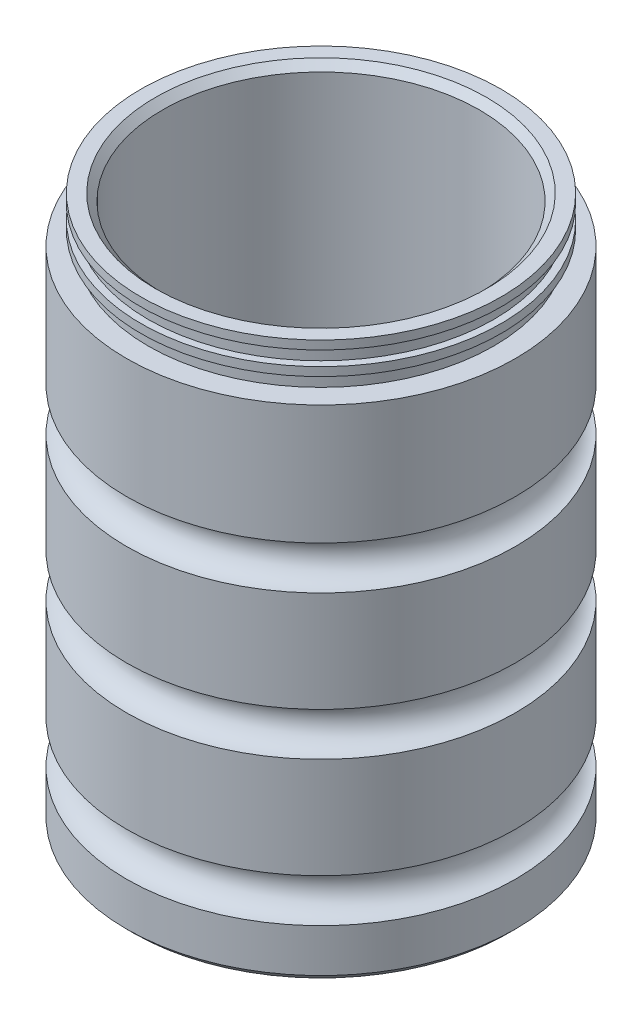
ISO-10303-21;
HEADER;
FILE_DESCRIPTION(('STEP AP214'),'2;1');
FILE_NAME('part.step','',(''),(''),'','','');
FILE_SCHEMA(('AUTOMOTIVE_DESIGN { 1 0 10303 214 1 1 1 1 }'));
ENDSEC;
DATA;
#1=APPLICATION_CONTEXT('core data for automotive mechanical design processes');
#2=APPLICATION_PROTOCOL_DEFINITION('international standard','automotive_design',2000,#1);
#3=PRODUCT_CONTEXT('',#1,'mechanical');
#4=PRODUCT('Part','Part','',(#3));
#5=PRODUCT_RELATED_PRODUCT_CATEGORY('part','',(#4));
#6=PRODUCT_DEFINITION_FORMATION('','',#4);
#7=PRODUCT_DEFINITION_CONTEXT('part definition',#1,'design');
#8=PRODUCT_DEFINITION('design','',#6,#7);
#9=PRODUCT_DEFINITION_SHAPE('','',#8);
#10=(LENGTH_UNIT() NAMED_UNIT(*) SI_UNIT(.MILLI.,.METRE.));
#11=(NAMED_UNIT(*) PLANE_ANGLE_UNIT() SI_UNIT($,.RADIAN.));
#12=(NAMED_UNIT(*) SI_UNIT($,.STERADIAN.) SOLID_ANGLE_UNIT());
#13=UNCERTAINTY_MEASURE_WITH_UNIT(LENGTH_MEASURE(1.E-05),#10,'distance_accuracy_value','');
#14=(GEOMETRIC_REPRESENTATION_CONTEXT(3) GLOBAL_UNCERTAINTY_ASSIGNED_CONTEXT((#13)) GLOBAL_UNIT_ASSIGNED_CONTEXT((#10,
#11,#12)) REPRESENTATION_CONTEXT('',''));
#15=CARTESIAN_POINT('',(0.,0.,0.));
#16=DIRECTION('',(0.,0.,1.));
#17=DIRECTION('',(1.,0.,0.));
#18=AXIS2_PLACEMENT_3D('',#15,#16,#17);
#19=CARTESIAN_POINT('',(0.,-29.1154086371947,0.));
#20=DIRECTION('',(0.,-1.,0.));
#21=DIRECTION('',(0.,0.,-1.));
#22=AXIS2_PLACEMENT_3D('',#19,#20,#21);
#23=CYLINDRICAL_SURFACE('',#22,11.);
#24=CARTESIAN_POINT('',(0.,37.5,0.));
#25=DIRECTION('',(0.,-1.,0.));
#26=DIRECTION('',(0.,0.,-1.));
#27=AXIS2_PLACEMENT_3D('',#24,#25,#26);
#28=CIRCLE('',#27,11.);
#29=CARTESIAN_POINT('',(0.,37.5,-11.));
#30=VERTEX_POINT('',#29);
#31=EDGE_CURVE('E49',#30,#30,#28,.F.);
#32=ORIENTED_EDGE('',*,*,#31,.T.);
#33=EDGE_LOOP('',(#32));
#34=FACE_BOUND('',#33,.T.);
#35=CARTESIAN_POINT('',(0.,12.,0.));
#36=DIRECTION('',(0.,-1.,0.));
#37=DIRECTION('',(0.,0.,-1.));
#38=AXIS2_PLACEMENT_3D('',#35,#36,#37);
#39=CIRCLE('',#38,11.);
#40=CARTESIAN_POINT('',(0.,12.,-11.));
#41=VERTEX_POINT('',#40);
#42=EDGE_CURVE('E82',#41,#41,#39,.T.);
#43=ORIENTED_EDGE('',*,*,#42,.T.);
#44=EDGE_LOOP('',(#43));
#45=FACE_BOUND('',#44,.T.);
#46=ADVANCED_FACE('F37',(#34,#45),#23,.F.);
#47=CARTESIAN_POINT('',(-11.,12.,0.));
#48=DIRECTION('',(0.,-1.,0.));
#49=DIRECTION('',(0.,0.,-1.));
#50=AXIS2_PLACEMENT_3D('',#47,#48,#49);
#51=PLANE('',#50);
#52=CARTESIAN_POINT('',(0.,12.,0.));
#53=DIRECTION('',(0.,-1.,0.));
#54=DIRECTION('',(0.,0.,-1.));
#55=AXIS2_PLACEMENT_3D('',#52,#53,#54);
#56=CIRCLE('',#55,2.5);
#57=CARTESIAN_POINT('',(0.,12.,-2.5));
#58=VERTEX_POINT('',#57);
#59=EDGE_CURVE('E79',#58,#58,#56,.T.);
#60=ORIENTED_EDGE('',*,*,#59,.T.);
#61=EDGE_LOOP('',(#60));
#62=FACE_BOUND('',#61,.T.);
#63=ORIENTED_EDGE('',*,*,#42,.F.);
#64=EDGE_LOOP('',(#63));
#65=FACE_BOUND('',#64,.T.);
#66=ADVANCED_FACE('F155',(#62,#65),#51,.F.);
#67=CARTESIAN_POINT('',(0.,0.,0.));
#68=DIRECTION('',(0.,1.,0.));
#69=DIRECTION('',(0.,0.,1.));
#70=AXIS2_PLACEMENT_3D('',#67,#68,#69);
#71=PLANE('',#70);
#72=CARTESIAN_POINT('',(0.,0.,0.));
#73=DIRECTION('',(0.,1.,0.));
#74=DIRECTION('',(0.,0.,1.));
#75=AXIS2_PLACEMENT_3D('',#72,#73,#74);
#76=CIRCLE('',#75,13.);
#77=CARTESIAN_POINT('',(0.,0.,13.));
#78=VERTEX_POINT('',#77);
#79=EDGE_CURVE('E45',#78,#78,#76,.F.);
#80=ORIENTED_EDGE('',*,*,#79,.T.);
#81=EDGE_LOOP('',(#80));
#82=FACE_BOUND('',#81,.T.);
#83=CARTESIAN_POINT('',(-8.,0.,0.));
#84=DIRECTION('',(0.,1.,0.));
#85=DIRECTION('',(0.,0.,1.));
#86=AXIS2_PLACEMENT_3D('',#83,#84,#85);
#87=CIRCLE('',#86,3.);
#88=CARTESIAN_POINT('',(-8.,0.,3.));
#89=VERTEX_POINT('',#88);
#90=EDGE_CURVE('E61',#89,#89,#87,.T.);
#91=ORIENTED_EDGE('',*,*,#90,.T.);
#92=EDGE_LOOP('',(#91));
#93=FACE_BOUND('',#92,.T.);
#94=CARTESIAN_POINT('',(8.,0.,0.));
#95=DIRECTION('',(0.,1.,0.));
#96=DIRECTION('',(0.,0.,1.));
#97=AXIS2_PLACEMENT_3D('',#94,#95,#96);
#98=CIRCLE('',#97,3.);
#99=CARTESIAN_POINT('',(8.,0.,3.));
#100=VERTEX_POINT('',#99);
#101=EDGE_CURVE('E64',#100,#100,#98,.T.);
#102=ORIENTED_EDGE('',*,*,#101,.T.);
#103=EDGE_LOOP('',(#102));
#104=FACE_BOUND('',#103,.T.);
#105=CARTESIAN_POINT('',(0.,0.,0.));
#106=DIRECTION('',(0.,1.,0.));
#107=DIRECTION('',(0.,0.,1.));
#108=AXIS2_PLACEMENT_3D('',#105,#106,#107);
#109=CIRCLE('',#108,2.5);
#110=CARTESIAN_POINT('',(0.,0.,2.5));
#111=VERTEX_POINT('',#110);
#112=EDGE_CURVE('E70',#111,#111,#109,.T.);
#113=ORIENTED_EDGE('',*,*,#112,.T.);
#114=EDGE_LOOP('',(#113));
#115=FACE_BOUND('',#114,.T.);
#116=ADVANCED_FACE('F161',(#82,#93,#104,#115),#71,.F.);
#117=CARTESIAN_POINT('',(0.,-29.1154086371947,0.));
#118=DIRECTION('',(0.,-1.,0.));
#119=DIRECTION('',(0.,0.,-1.));
#120=AXIS2_PLACEMENT_3D('',#117,#118,#119);
#121=CYLINDRICAL_SURFACE('',#120,13.5);
#122=CARTESIAN_POINT('',(0.,0.500000000000004,0.));
#123=DIRECTION('',(0.,1.,0.));
#124=DIRECTION('',(0.,0.,1.));
#125=AXIS2_PLACEMENT_3D('',#122,#123,#124);
#126=CIRCLE('',#125,13.5);
#127=CARTESIAN_POINT('',(0.,0.500000000000004,13.5));
#128=VERTEX_POINT('',#127);
#129=EDGE_CURVE('E10',#128,#128,#126,.T.);
#130=ORIENTED_EDGE('',*,*,#129,.T.);
#131=EDGE_LOOP('',(#130));
#132=FACE_BOUND('',#131,.T.);
#133=CARTESIAN_POINT('',(0.,3.5,0.));
#134=DIRECTION('',(0.,-1.,0.));
#135=DIRECTION('',(0.,0.,-1.));
#136=AXIS2_PLACEMENT_3D('',#133,#134,#135);
#137=CIRCLE('',#136,13.5);
#138=CARTESIAN_POINT('',(0.,3.5,-13.5));
#139=VERTEX_POINT('',#138);
#140=EDGE_CURVE('E85',#139,#139,#137,.T.);
#141=ORIENTED_EDGE('',*,*,#140,.T.);
#142=EDGE_LOOP('',(#141));
#143=FACE_BOUND('',#142,.T.);
#144=ADVANCED_FACE('F273',(#132,#143),#121,.T.);
#145=CARTESIAN_POINT('',(0.,5.,0.));
#146=DIRECTION('',(0.,-1.,0.));
#147=DIRECTION('',(0.,0.,-1.));
#148=AXIS2_PLACEMENT_3D('',#145,#146,#147);
#149=TOROIDAL_SURFACE('',#148,13.5,1.5);
#150=ORIENTED_EDGE('',*,*,#140,.F.);
#151=EDGE_LOOP('',(#150));
#152=FACE_BOUND('',#151,.T.);
#153=CARTESIAN_POINT('',(0.,6.5,0.));
#154=DIRECTION('',(0.,-1.,0.));
#155=DIRECTION('',(0.,0.,-1.));
#156=AXIS2_PLACEMENT_3D('',#153,#154,#155);
#157=CIRCLE('',#156,13.5);
#158=CARTESIAN_POINT('',(0.,6.5,-13.5));
#159=VERTEX_POINT('',#158);
#160=EDGE_CURVE('E88',#159,#159,#157,.T.);
#161=ORIENTED_EDGE('',*,*,#160,.T.);
#162=EDGE_LOOP('',(#161));
#163=FACE_BOUND('',#162,.T.);
#164=ADVANCED_FACE('F269',(#152,#163),#149,.F.);
#165=CARTESIAN_POINT('',(0.,-29.1154086371947,0.));
#166=DIRECTION('',(0.,-1.,0.));
#167=DIRECTION('',(0.,0.,-1.));
#168=AXIS2_PLACEMENT_3D('',#165,#166,#167);
#169=CYLINDRICAL_SURFACE('',#168,13.5);
#170=ORIENTED_EDGE('',*,*,#160,.F.);
#171=EDGE_LOOP('',(#170));
#172=FACE_BOUND('',#171,.T.);
#173=CARTESIAN_POINT('',(0.,13.5,0.));
#174=DIRECTION('',(0.,-1.,0.));
#175=DIRECTION('',(0.,0.,-1.));
#176=AXIS2_PLACEMENT_3D('',#173,#174,#175);
#177=CIRCLE('',#176,13.5);
#178=CARTESIAN_POINT('',(0.,13.5,-13.5));
#179=VERTEX_POINT('',#178);
#180=EDGE_CURVE('E91',#179,#179,#177,.T.);
#181=ORIENTED_EDGE('',*,*,#180,.T.);
#182=EDGE_LOOP('',(#181));
#183=FACE_BOUND('',#182,.T.);
#184=ADVANCED_FACE('F265',(#172,#183),#169,.T.);
#185=CARTESIAN_POINT('',(0.,15.,0.));
#186=DIRECTION('',(0.,-1.,0.));
#187=DIRECTION('',(0.,0.,-1.));
#188=AXIS2_PLACEMENT_3D('',#185,#186,#187);
#189=TOROIDAL_SURFACE('',#188,13.5,1.5);
#190=ORIENTED_EDGE('',*,*,#180,.F.);
#191=EDGE_LOOP('',(#190));
#192=FACE_BOUND('',#191,.T.);
#193=CARTESIAN_POINT('',(0.,16.5,0.));
#194=DIRECTION('',(0.,-1.,0.));
#195=DIRECTION('',(0.,0.,-1.));
#196=AXIS2_PLACEMENT_3D('',#193,#194,#195);
#197=CIRCLE('',#196,13.5);
#198=CARTESIAN_POINT('',(0.,16.5,-13.5));
#199=VERTEX_POINT('',#198);
#200=EDGE_CURVE('E94',#199,#199,#197,.T.);
#201=ORIENTED_EDGE('',*,*,#200,.T.);
#202=EDGE_LOOP('',(#201));
#203=FACE_BOUND('',#202,.T.);
#204=ADVANCED_FACE('F261',(#192,#203),#189,.F.);
#205=CARTESIAN_POINT('',(0.,-29.1154086371947,0.));
#206=DIRECTION('',(0.,-1.,0.));
#207=DIRECTION('',(0.,0.,-1.));
#208=AXIS2_PLACEMENT_3D('',#205,#206,#207);
#209=CYLINDRICAL_SURFACE('',#208,13.5);
#210=ORIENTED_EDGE('',*,*,#200,.F.);
#211=EDGE_LOOP('',(#210));
#212=FACE_BOUND('',#211,.T.);
#213=CARTESIAN_POINT('',(0.,23.5,0.));
#214=DIRECTION('',(0.,-1.,0.));
#215=DIRECTION('',(0.,0.,-1.));
#216=AXIS2_PLACEMENT_3D('',#213,#214,#215);
#217=CIRCLE('',#216,13.5);
#218=CARTESIAN_POINT('',(0.,23.5,-13.5));
#219=VERTEX_POINT('',#218);
#220=EDGE_CURVE('E97',#219,#219,#217,.T.);
#221=ORIENTED_EDGE('',*,*,#220,.T.);
#222=EDGE_LOOP('',(#221));
#223=FACE_BOUND('',#222,.T.);
#224=ADVANCED_FACE('F257',(#212,#223),#209,.T.);
#225=CARTESIAN_POINT('',(0.,25.,0.));
#226=DIRECTION('',(0.,-1.,0.));
#227=DIRECTION('',(0.,0.,-1.));
#228=AXIS2_PLACEMENT_3D('',#225,#226,#227);
#229=TOROIDAL_SURFACE('',#228,13.5,1.5);
#230=ORIENTED_EDGE('',*,*,#220,.F.);
#231=EDGE_LOOP('',(#230));
#232=FACE_BOUND('',#231,.T.);
#233=CARTESIAN_POINT('',(0.,26.5,0.));
#234=DIRECTION('',(0.,-1.,0.));
#235=DIRECTION('',(0.,0.,-1.));
#236=AXIS2_PLACEMENT_3D('',#233,#234,#235);
#237=CIRCLE('',#236,13.5);
#238=CARTESIAN_POINT('',(0.,26.5,-13.5));
#239=VERTEX_POINT('',#238);
#240=EDGE_CURVE('E100',#239,#239,#237,.T.);
#241=ORIENTED_EDGE('',*,*,#240,.T.);
#242=EDGE_LOOP('',(#241));
#243=FACE_BOUND('',#242,.T.);
#244=ADVANCED_FACE('F253',(#232,#243),#229,.F.);
#245=CARTESIAN_POINT('',(0.,-29.1154086371947,0.));
#246=DIRECTION('',(0.,-1.,0.));
#247=DIRECTION('',(0.,0.,-1.));
#248=AXIS2_PLACEMENT_3D('',#245,#246,#247);
#249=CYLINDRICAL_SURFACE('',#248,13.5);
#250=ORIENTED_EDGE('',*,*,#240,.F.);
#251=EDGE_LOOP('',(#250));
#252=FACE_BOUND('',#251,.T.);
#253=CARTESIAN_POINT('',(0.,34.8,0.));
#254=DIRECTION('',(0.,-1.,0.));
#255=DIRECTION('',(0.,0.,-1.));
#256=AXIS2_PLACEMENT_3D('',#253,#254,#255);
#257=CIRCLE('',#256,13.5);
#258=CARTESIAN_POINT('',(0.,34.8,-13.5));
#259=VERTEX_POINT('',#258);
#260=EDGE_CURVE('E103',#259,#259,#257,.T.);
#261=ORIENTED_EDGE('',*,*,#260,.T.);
#262=EDGE_LOOP('',(#261));
#263=FACE_BOUND('',#262,.T.);
#264=ADVANCED_FACE('F249',(#252,#263),#249,.T.);
#265=CARTESIAN_POINT('',(-12.,34.8,0.));
#266=DIRECTION('',(0.,-1.,0.));
#267=DIRECTION('',(0.,0.,-1.));
#268=AXIS2_PLACEMENT_3D('',#265,#266,#267);
#269=PLANE('',#268);
#270=ORIENTED_EDGE('',*,*,#260,.F.);
#271=EDGE_LOOP('',(#270));
#272=FACE_BOUND('',#271,.T.);
#273=CARTESIAN_POINT('',(0.,34.8,0.));
#274=DIRECTION('',(0.,-1.,0.));
#275=DIRECTION('',(0.,0.,-1.));
#276=AXIS2_PLACEMENT_3D('',#273,#274,#275);
#277=CIRCLE('',#276,12.);
#278=CARTESIAN_POINT('',(0.,34.8,-12.));
#279=VERTEX_POINT('',#278);
#280=EDGE_CURVE('E106',#279,#279,#277,.T.);
#281=ORIENTED_EDGE('',*,*,#280,.T.);
#282=EDGE_LOOP('',(#281));
#283=FACE_BOUND('',#282,.T.);
#284=ADVANCED_FACE('F245',(#272,#283),#269,.F.);
#285=CARTESIAN_POINT('',(0.,-29.1154086371947,0.));
#286=DIRECTION('',(0.,-1.,0.));
#287=DIRECTION('',(0.,0.,-1.));
#288=AXIS2_PLACEMENT_3D('',#285,#286,#287);
#289=CYLINDRICAL_SURFACE('',#288,12.);
#290=ORIENTED_EDGE('',*,*,#280,.F.);
#291=EDGE_LOOP('',(#290));
#292=FACE_BOUND('',#291,.T.);
#293=CARTESIAN_POINT('',(0.,35.8,0.));
#294=DIRECTION('',(0.,-1.,0.));
#295=DIRECTION('',(0.,0.,-1.));
#296=AXIS2_PLACEMENT_3D('',#293,#294,#295);
#297=CIRCLE('',#296,12.);
#298=CARTESIAN_POINT('',(0.,35.8,-12.));
#299=VERTEX_POINT('',#298);
#300=EDGE_CURVE('E109',#299,#299,#297,.T.);
#301=ORIENTED_EDGE('',*,*,#300,.T.);
#302=EDGE_LOOP('',(#301));
#303=FACE_BOUND('',#302,.T.);
#304=ADVANCED_FACE('F241',(#292,#303),#289,.T.);
#305=CARTESIAN_POINT('',(-12.5,35.8,0.));
#306=DIRECTION('',(0.,1.,0.));
#307=DIRECTION('',(0.,0.,1.));
#308=AXIS2_PLACEMENT_3D('',#305,#306,#307);
#309=PLANE('',#308);
#310=ORIENTED_EDGE('',*,*,#300,.F.);
#311=EDGE_LOOP('',(#310));
#312=FACE_BOUND('',#311,.T.);
#313=CARTESIAN_POINT('',(0.,35.8,0.));
#314=DIRECTION('',(0.,-1.,0.));
#315=DIRECTION('',(0.,0.,-1.));
#316=AXIS2_PLACEMENT_3D('',#313,#314,#315);
#317=CIRCLE('',#316,12.5);
#318=CARTESIAN_POINT('',(0.,35.8,-12.5));
#319=VERTEX_POINT('',#318);
#320=EDGE_CURVE('E112',#319,#319,#317,.T.);
#321=ORIENTED_EDGE('',*,*,#320,.T.);
#322=EDGE_LOOP('',(#321));
#323=FACE_BOUND('',#322,.T.);
#324=ADVANCED_FACE('F237',(#312,#323),#309,.F.);
#325=CARTESIAN_POINT('',(0.,-29.1154086371947,0.));
#326=DIRECTION('',(0.,-1.,0.));
#327=DIRECTION('',(0.,0.,-1.));
#328=AXIS2_PLACEMENT_3D('',#325,#326,#327);
#329=CYLINDRICAL_SURFACE('',#328,12.5);
#330=ORIENTED_EDGE('',*,*,#320,.F.);
#331=EDGE_LOOP('',(#330));
#332=FACE_BOUND('',#331,.T.);
#333=CARTESIAN_POINT('',(0.,36.4,0.));
#334=DIRECTION('',(0.,-1.,0.));
#335=DIRECTION('',(0.,0.,-1.));
#336=AXIS2_PLACEMENT_3D('',#333,#334,#335);
#337=CIRCLE('',#336,12.5);
#338=CARTESIAN_POINT('',(0.,36.4,-12.5));
#339=VERTEX_POINT('',#338);
#340=EDGE_CURVE('E115',#339,#339,#337,.T.);
#341=ORIENTED_EDGE('',*,*,#340,.T.);
#342=EDGE_LOOP('',(#341));
#343=FACE_BOUND('',#342,.T.);
#344=ADVANCED_FACE('F233',(#332,#343),#329,.T.);
#345=CARTESIAN_POINT('',(-12.,36.4,0.));
#346=DIRECTION('',(0.,-1.,0.));
#347=DIRECTION('',(0.,0.,-1.));
#348=AXIS2_PLACEMENT_3D('',#345,#346,#347);
#349=PLANE('',#348);
#350=ORIENTED_EDGE('',*,*,#340,.F.);
#351=EDGE_LOOP('',(#350));
#352=FACE_BOUND('',#351,.T.);
#353=CARTESIAN_POINT('',(0.,36.4,0.));
#354=DIRECTION('',(0.,-1.,0.));
#355=DIRECTION('',(0.,0.,-1.));
#356=AXIS2_PLACEMENT_3D('',#353,#354,#355);
#357=CIRCLE('',#356,12.);
#358=CARTESIAN_POINT('',(0.,36.4,-12.));
#359=VERTEX_POINT('',#358);
#360=EDGE_CURVE('E118',#359,#359,#357,.T.);
#361=ORIENTED_EDGE('',*,*,#360,.T.);
#362=EDGE_LOOP('',(#361));
#363=FACE_BOUND('',#362,.T.);
#364=ADVANCED_FACE('F229',(#352,#363),#349,.F.);
#365=CARTESIAN_POINT('',(0.,-29.1154086371947,0.));
#366=DIRECTION('',(0.,-1.,0.));
#367=DIRECTION('',(0.,0.,-1.));
#368=AXIS2_PLACEMENT_3D('',#365,#366,#367);
#369=CYLINDRICAL_SURFACE('',#368,12.);
#370=ORIENTED_EDGE('',*,*,#360,.F.);
#371=EDGE_LOOP('',(#370));
#372=FACE_BOUND('',#371,.T.);
#373=CARTESIAN_POINT('',(0.,37.4,0.));
#374=DIRECTION('',(0.,-1.,0.));
#375=DIRECTION('',(0.,0.,-1.));
#376=AXIS2_PLACEMENT_3D('',#373,#374,#375);
#377=CIRCLE('',#376,12.);
#378=CARTESIAN_POINT('',(0.,37.4,-12.));
#379=VERTEX_POINT('',#378);
#380=EDGE_CURVE('E121',#379,#379,#377,.T.);
#381=ORIENTED_EDGE('',*,*,#380,.T.);
#382=EDGE_LOOP('',(#381));
#383=FACE_BOUND('',#382,.T.);
#384=ADVANCED_FACE('F222',(#372,#383),#369,.T.);
#385=CARTESIAN_POINT('',(-12.5,37.4,0.));
#386=DIRECTION('',(0.,1.,0.));
#387=DIRECTION('',(0.,0.,1.));
#388=AXIS2_PLACEMENT_3D('',#385,#386,#387);
#389=PLANE('',#388);
#390=ORIENTED_EDGE('',*,*,#380,.F.);
#391=EDGE_LOOP('',(#390));
#392=FACE_BOUND('',#391,.T.);
#393=CARTESIAN_POINT('',(0.,37.4,0.));
#394=DIRECTION('',(0.,-1.,0.));
#395=DIRECTION('',(0.,0.,-1.));
#396=AXIS2_PLACEMENT_3D('',#393,#394,#395);
#397=CIRCLE('',#396,12.5);
#398=CARTESIAN_POINT('',(0.,37.4,-12.5));
#399=VERTEX_POINT('',#398);
#400=EDGE_CURVE('E124',#399,#399,#397,.T.);
#401=ORIENTED_EDGE('',*,*,#400,.T.);
#402=EDGE_LOOP('',(#401));
#403=FACE_BOUND('',#402,.T.);
#404=ADVANCED_FACE('F216',(#392,#403),#389,.F.);
#405=CARTESIAN_POINT('',(0.,-29.1154086371947,0.));
#406=DIRECTION('',(0.,-1.,0.));
#407=DIRECTION('',(0.,0.,-1.));
#408=AXIS2_PLACEMENT_3D('',#405,#406,#407);
#409=CYLINDRICAL_SURFACE('',#408,12.5);
#410=ORIENTED_EDGE('',*,*,#400,.F.);
#411=EDGE_LOOP('',(#410));
#412=FACE_BOUND('',#411,.T.);
#413=CARTESIAN_POINT('',(0.,38.,0.));
#414=DIRECTION('',(0.,-1.,0.));
#415=DIRECTION('',(0.,0.,-1.));
#416=AXIS2_PLACEMENT_3D('',#413,#414,#415);
#417=CIRCLE('',#416,12.5);
#418=CARTESIAN_POINT('',(0.,38.,-12.5));
#419=VERTEX_POINT('',#418);
#420=EDGE_CURVE('E127',#419,#419,#417,.T.);
#421=ORIENTED_EDGE('',*,*,#420,.T.);
#422=EDGE_LOOP('',(#421));
#423=FACE_BOUND('',#422,.T.);
#424=ADVANCED_FACE('F211',(#412,#423),#409,.T.);
#425=CARTESIAN_POINT('',(-12.5,38.,0.));
#426=DIRECTION('',(0.,-1.,0.));
#427=DIRECTION('',(0.,0.,-1.));
#428=AXIS2_PLACEMENT_3D('',#425,#426,#427);
#429=PLANE('',#428);
#430=CARTESIAN_POINT('',(0.,38.,0.));
#431=DIRECTION('',(0.,-1.,0.));
#432=DIRECTION('',(0.,0.,-1.));
#433=AXIS2_PLACEMENT_3D('',#430,#431,#432);
#434=CIRCLE('',#433,11.5);
#435=CARTESIAN_POINT('',(0.,38.,-11.5));
#436=VERTEX_POINT('',#435);
#437=EDGE_CURVE('E53',#436,#436,#434,.T.);
#438=ORIENTED_EDGE('',*,*,#437,.T.);
#439=EDGE_LOOP('',(#438));
#440=FACE_BOUND('',#439,.T.);
#441=ORIENTED_EDGE('',*,*,#420,.F.);
#442=EDGE_LOOP('',(#441));
#443=FACE_BOUND('',#442,.T.);
#444=ADVANCED_FACE('F208',(#440,#443),#429,.F.);
#445=CARTESIAN_POINT('',(-8.,10.,0.));
#446=DIRECTION('',(0.,-1.,0.));
#447=DIRECTION('',(0.,0.,-1.));
#448=AXIS2_PLACEMENT_3D('',#445,#446,#447);
#449=CYLINDRICAL_SURFACE('',#448,2.5);
#450=CARTESIAN_POINT('',(-8.,0.499999999999997,0.));
#451=DIRECTION('',(0.,1.,0.));
#452=DIRECTION('',(0.,0.,1.));
#453=AXIS2_PLACEMENT_3D('',#450,#451,#452);
#454=CIRCLE('',#453,2.5);
#455=CARTESIAN_POINT('',(-8.,0.499999999999997,2.5));
#456=VERTEX_POINT('',#455);
#457=EDGE_CURVE('E67',#456,#456,#454,.F.);
#458=ORIENTED_EDGE('',*,*,#457,.T.);
#459=EDGE_LOOP('',(#458));
#460=FACE_BOUND('',#459,.T.);
#461=CARTESIAN_POINT('',(-8.,10.,0.));
#462=DIRECTION('',(0.,-1.,0.));
#463=DIRECTION('',(0.,0.,-1.));
#464=AXIS2_PLACEMENT_3D('',#461,#462,#463);
#465=CIRCLE('',#464,2.5);
#466=CARTESIAN_POINT('',(-8.,10.,-2.5));
#467=VERTEX_POINT('',#466);
#468=EDGE_CURVE('E131',#467,#467,#465,.T.);
#469=ORIENTED_EDGE('',*,*,#468,.F.);
#470=EDGE_LOOP('',(#469));
#471=FACE_BOUND('',#470,.T.);
#472=ADVANCED_FACE('F150',(#460,#471),#449,.F.);
#473=CARTESIAN_POINT('',(-8.,10.,0.));
#474=DIRECTION('',(0.,-1.,0.));
#475=DIRECTION('',(0.,0.,-1.));
#476=AXIS2_PLACEMENT_3D('',#473,#474,#475);
#477=PLANE('',#476);
#478=ORIENTED_EDGE('',*,*,#468,.T.);
#479=EDGE_LOOP('',(#478));
#480=FACE_BOUND('',#479,.T.);
#481=ADVANCED_FACE('F141',(#480),#477,.T.);
#482=CARTESIAN_POINT('',(8.,10.,0.));
#483=DIRECTION('',(0.,-1.,0.));
#484=DIRECTION('',(0.,0.,-1.));
#485=AXIS2_PLACEMENT_3D('',#482,#483,#484);
#486=CYLINDRICAL_SURFACE('',#485,2.5);
#487=CARTESIAN_POINT('',(8.,0.499999999999997,0.));
#488=DIRECTION('',(0.,1.,0.));
#489=DIRECTION('',(0.,0.,1.));
#490=AXIS2_PLACEMENT_3D('',#487,#488,#489);
#491=CIRCLE('',#490,2.5);
#492=CARTESIAN_POINT('',(8.,0.499999999999997,2.5));
#493=VERTEX_POINT('',#492);
#494=EDGE_CURVE('E58',#493,#493,#491,.F.);
#495=ORIENTED_EDGE('',*,*,#494,.T.);
#496=EDGE_LOOP('',(#495));
#497=FACE_BOUND('',#496,.T.);
#498=CARTESIAN_POINT('',(8.,10.,0.));
#499=DIRECTION('',(0.,-1.,0.));
#500=DIRECTION('',(0.,0.,-1.));
#501=AXIS2_PLACEMENT_3D('',#498,#499,#500);
#502=CIRCLE('',#501,2.5);
#503=CARTESIAN_POINT('',(8.,10.,-2.5));
#504=VERTEX_POINT('',#503);
#505=EDGE_CURVE('E130',#504,#504,#502,.T.);
#506=ORIENTED_EDGE('',*,*,#505,.F.);
#507=EDGE_LOOP('',(#506));
#508=FACE_BOUND('',#507,.T.);
#509=ADVANCED_FACE('F139',(#497,#508),#486,.F.);
#510=CARTESIAN_POINT('',(8.,10.,0.));
#511=DIRECTION('',(0.,-1.,0.));
#512=DIRECTION('',(0.,0.,-1.));
#513=AXIS2_PLACEMENT_3D('',#510,#511,#512);
#514=PLANE('',#513);
#515=ORIENTED_EDGE('',*,*,#505,.T.);
#516=EDGE_LOOP('',(#515));
#517=FACE_BOUND('',#516,.T.);
#518=ADVANCED_FACE('F137',(#517),#514,.T.);
#519=CARTESIAN_POINT('',(0.,38.,0.));
#520=DIRECTION('',(0.,-1.,0.));
#521=DIRECTION('',(0.,0.,-1.));
#522=AXIS2_PLACEMENT_3D('',#519,#520,#521);
#523=CYLINDRICAL_SURFACE('',#522,2.);
#524=CARTESIAN_POINT('',(0.,11.5,0.));
#525=DIRECTION('',(0.,-1.,0.));
#526=DIRECTION('',(0.,0.,-1.));
#527=AXIS2_PLACEMENT_3D('',#524,#525,#526);
#528=CIRCLE('',#527,2.);
#529=CARTESIAN_POINT('',(0.,11.5,-2.));
#530=VERTEX_POINT('',#529);
#531=EDGE_CURVE('E73',#530,#530,#528,.F.);
#532=ORIENTED_EDGE('',*,*,#531,.T.);
#533=EDGE_LOOP('',(#532));
#534=FACE_BOUND('',#533,.T.);
#535=CARTESIAN_POINT('',(0.,0.5,0.));
#536=DIRECTION('',(0.,1.,0.));
#537=DIRECTION('',(0.,0.,1.));
#538=AXIS2_PLACEMENT_3D('',#535,#536,#537);
#539=CIRCLE('',#538,2.);
#540=CARTESIAN_POINT('',(0.,0.5,2.));
#541=VERTEX_POINT('',#540);
#542=EDGE_CURVE('E76',#541,#541,#539,.F.);
#543=ORIENTED_EDGE('',*,*,#542,.T.);
#544=EDGE_LOOP('',(#543));
#545=FACE_BOUND('',#544,.T.);
#546=ADVANCED_FACE('F148',(#534,#545),#523,.F.);
#547=CARTESIAN_POINT('',(0.,12.,0.));
#548=DIRECTION('',(0.,1.,0.));
#549=DIRECTION('',(0.,0.,1.));
#550=AXIS2_PLACEMENT_3D('',#547,#548,#549);
#551=CONICAL_SURFACE('',#550,2.5,0.78539816339745);
#552=ORIENTED_EDGE('',*,*,#531,.F.);
#553=EDGE_LOOP('',(#552));
#554=FACE_BOUND('',#553,.T.);
#555=ORIENTED_EDGE('',*,*,#59,.F.);
#556=EDGE_LOOP('',(#555));
#557=FACE_BOUND('',#556,.T.);
#558=ADVANCED_FACE('F168',(#554,#557),#551,.F.);
#559=CARTESIAN_POINT('',(0.,0.5,0.));
#560=DIRECTION('',(0.,-1.,0.));
#561=DIRECTION('',(0.,0.,-1.));
#562=AXIS2_PLACEMENT_3D('',#559,#560,#561);
#563=CONICAL_SURFACE('',#562,2.,0.78539816339745);
#564=ORIENTED_EDGE('',*,*,#112,.F.);
#565=EDGE_LOOP('',(#564));
#566=FACE_BOUND('',#565,.T.);
#567=ORIENTED_EDGE('',*,*,#542,.F.);
#568=EDGE_LOOP('',(#567));
#569=FACE_BOUND('',#568,.T.);
#570=ADVANCED_FACE('F174',(#566,#569),#563,.F.);
#571=CARTESIAN_POINT('',(-8.,0.499999999999997,0.));
#572=DIRECTION('',(0.,-1.,0.));
#573=DIRECTION('',(0.,0.,-1.));
#574=AXIS2_PLACEMENT_3D('',#571,#572,#573);
#575=CONICAL_SURFACE('',#574,2.5,0.785398163397447);
#576=ORIENTED_EDGE('',*,*,#90,.F.);
#577=EDGE_LOOP('',(#576));
#578=FACE_BOUND('',#577,.T.);
#579=ORIENTED_EDGE('',*,*,#457,.F.);
#580=EDGE_LOOP('',(#579));
#581=FACE_BOUND('',#580,.T.);
#582=ADVANCED_FACE('F181',(#578,#581),#575,.F.);
#583=CARTESIAN_POINT('',(8.,0.499999999999997,0.));
#584=DIRECTION('',(0.,-1.,0.));
#585=DIRECTION('',(0.,0.,-1.));
#586=AXIS2_PLACEMENT_3D('',#583,#584,#585);
#587=CONICAL_SURFACE('',#586,2.5,0.785398163397447);
#588=ORIENTED_EDGE('',*,*,#101,.F.);
#589=EDGE_LOOP('',(#588));
#590=FACE_BOUND('',#589,.T.);
#591=ORIENTED_EDGE('',*,*,#494,.F.);
#592=EDGE_LOOP('',(#591));
#593=FACE_BOUND('',#592,.T.);
#594=ADVANCED_FACE('F188',(#590,#593),#587,.F.);
#595=CARTESIAN_POINT('',(0.,38.,0.));
#596=DIRECTION('',(0.,1.,0.));
#597=DIRECTION('',(0.,0.,1.));
#598=AXIS2_PLACEMENT_3D('',#595,#596,#597);
#599=CONICAL_SURFACE('',#598,11.5,0.785398163397455);
#600=ORIENTED_EDGE('',*,*,#31,.F.);
#601=EDGE_LOOP('',(#600));
#602=FACE_BOUND('',#601,.T.);
#603=ORIENTED_EDGE('',*,*,#437,.F.);
#604=EDGE_LOOP('',(#603));
#605=FACE_BOUND('',#604,.T.);
#606=ADVANCED_FACE('F194',(#602,#605),#599,.F.);
#607=CARTESIAN_POINT('',(0.,0.,0.));
#608=DIRECTION('',(0.,1.,0.));
#609=DIRECTION('',(0.,0.,1.));
#610=AXIS2_PLACEMENT_3D('',#607,#608,#609);
#611=CONICAL_SURFACE('',#610,13.,0.785398163397452);
#612=ORIENTED_EDGE('',*,*,#129,.F.);
#613=EDGE_LOOP('',(#612));
#614=FACE_BOUND('',#613,.T.);
#615=ORIENTED_EDGE('',*,*,#79,.F.);
#616=EDGE_LOOP('',(#615));
#617=FACE_BOUND('',#616,.T.);
#618=ADVANCED_FACE('F40',(#614,#617),#611,.T.);
#619=CLOSED_SHELL('',(#46,#66,#116,#144,#164,#184,#204,#224,#244,#264,#284,#304,#324,#344,#364,
#384,#404,#424,#444,#472,#481,#509,#518,#546,#558,#570,#582,#594,#606,#618));
#620=MANIFOLD_SOLID_BREP('B2',#619);
#621=ADVANCED_BREP_SHAPE_REPRESENTATION('',(#18,#620),#14);
#622=SHAPE_DEFINITION_REPRESENTATION(#9,#621);
ENDSEC;
END-ISO-10303-21;
